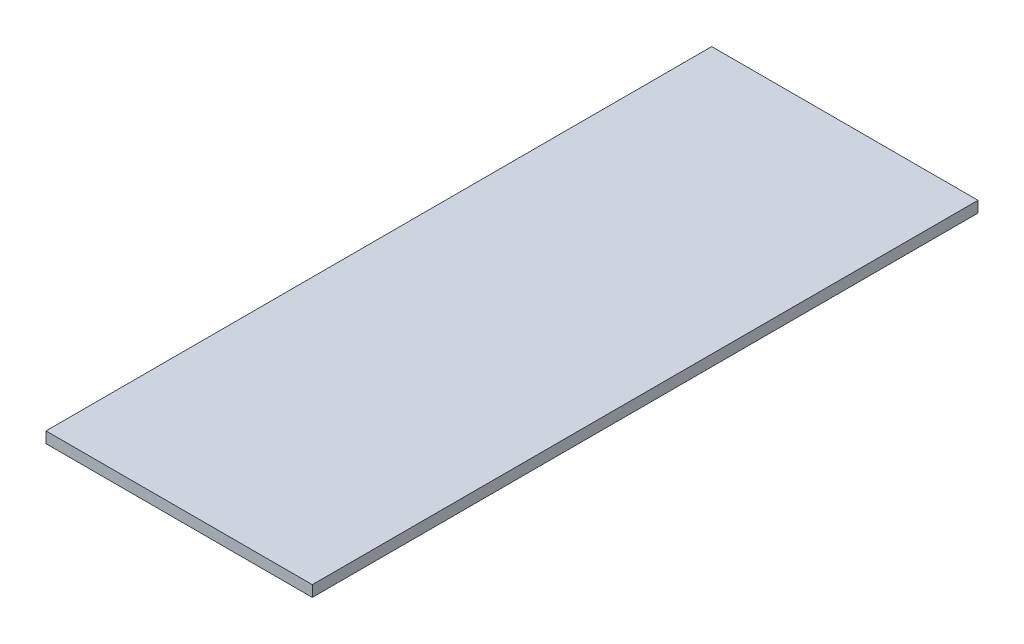
ISO-10303-21;
HEADER;
FILE_DESCRIPTION(('STEP AP214'),'2;1');
FILE_NAME('part.step','',(''),(''),'','','');
FILE_SCHEMA(('AUTOMOTIVE_DESIGN { 1 0 10303 214 1 1 1 1 }'));
ENDSEC;
DATA;
#1=APPLICATION_CONTEXT('core data for automotive mechanical design processes');
#2=APPLICATION_PROTOCOL_DEFINITION('international standard','automotive_design',2000,#1);
#3=PRODUCT_CONTEXT('',#1,'mechanical');
#4=PRODUCT('Part','Part','',(#3));
#5=PRODUCT_RELATED_PRODUCT_CATEGORY('part','',(#4));
#6=PRODUCT_DEFINITION_FORMATION('','',#4);
#7=PRODUCT_DEFINITION_CONTEXT('part definition',#1,'design');
#8=PRODUCT_DEFINITION('design','',#6,#7);
#9=PRODUCT_DEFINITION_SHAPE('','',#8);
#10=(LENGTH_UNIT() NAMED_UNIT(*) SI_UNIT(.MILLI.,.METRE.));
#11=(NAMED_UNIT(*) PLANE_ANGLE_UNIT() SI_UNIT($,.RADIAN.));
#12=(NAMED_UNIT(*) SI_UNIT($,.STERADIAN.) SOLID_ANGLE_UNIT());
#13=UNCERTAINTY_MEASURE_WITH_UNIT(LENGTH_MEASURE(1.E-05),#10,'distance_accuracy_value','');
#14=(GEOMETRIC_REPRESENTATION_CONTEXT(3) GLOBAL_UNCERTAINTY_ASSIGNED_CONTEXT((#13)) GLOBAL_UNIT_ASSIGNED_CONTEXT((#10,
#11,#12)) REPRESENTATION_CONTEXT('',''));
#15=CARTESIAN_POINT('',(0.,0.,0.));
#16=DIRECTION('',(0.,0.,1.));
#17=DIRECTION('',(1.,0.,0.));
#18=AXIS2_PLACEMENT_3D('',#15,#16,#17);
#19=CARTESIAN_POINT('',(-101.402602108138,6.35,-303.781267969407));
#20=DIRECTION('',(1.,0.,0.));
#21=DIRECTION('',(0.,0.,-1.));
#22=AXIS2_PLACEMENT_3D('',#19,#20,#21);
#23=PLANE('',#22);
#24=DIRECTION('',(0.,0.,1.));
#25=VECTOR('',#24,1.);
#26=CARTESIAN_POINT('',(-101.402602108138,0.,-303.781267969407));
#27=LINE('',#26,#25);
#28=CARTESIAN_POINT('',(-101.402602108138,0.,-303.781267969407));
#29=VERTEX_POINT('',#28);
#30=CARTESIAN_POINT('',(-101.402602108138,0.,77.2187320305928));
#31=VERTEX_POINT('',#30);
#32=EDGE_CURVE('E94',#29,#31,#27,.T.);
#33=ORIENTED_EDGE('',*,*,#32,.T.);
#34=DIRECTION('',(0.,-1.,0.));
#35=VECTOR('',#34,1.);
#36=CARTESIAN_POINT('',(-101.402602108138,6.35,77.2187320305928));
#37=LINE('',#36,#35);
#38=CARTESIAN_POINT('',(-101.402602108138,6.35,77.2187320305928));
#39=VERTEX_POINT('',#38);
#40=EDGE_CURVE('E11',#39,#31,#37,.T.);
#41=ORIENTED_EDGE('',*,*,#40,.F.);
#42=DIRECTION('',(0.,0.,1.));
#43=VECTOR('',#42,1.);
#44=CARTESIAN_POINT('',(-101.402602108138,6.35,-303.781267969407));
#45=LINE('',#44,#43);
#46=CARTESIAN_POINT('',(-101.402602108138,6.35,-303.781267969407));
#47=VERTEX_POINT('',#46);
#48=EDGE_CURVE('E82',#47,#39,#45,.T.);
#49=ORIENTED_EDGE('',*,*,#48,.F.);
#50=DIRECTION('',(0.,-1.,0.));
#51=VECTOR('',#50,1.);
#52=CARTESIAN_POINT('',(-101.402602108138,6.35,-303.781267969407));
#53=LINE('',#52,#51);
#54=EDGE_CURVE('E90',#47,#29,#53,.T.);
#55=ORIENTED_EDGE('',*,*,#54,.T.);
#56=EDGE_LOOP('',(#33,#41,#49,#55));
#57=FACE_BOUND('',#56,.T.);
#58=ADVANCED_FACE('F31',(#57),#23,.F.);
#59=CARTESIAN_POINT('',(-101.402602108138,6.35,77.2187320305928));
#60=DIRECTION('',(0.,0.,-1.));
#61=DIRECTION('',(-1.,0.,0.));
#62=AXIS2_PLACEMENT_3D('',#59,#60,#61);
#63=PLANE('',#62);
#64=DIRECTION('',(1.,0.,0.));
#65=VECTOR('',#64,1.);
#66=CARTESIAN_POINT('',(-101.402602108138,0.,77.2187320305928));
#67=LINE('',#66,#65);
#68=CARTESIAN_POINT('',(50.9973978918621,0.,77.2187320305928));
#69=VERTEX_POINT('',#68);
#70=EDGE_CURVE('E86',#31,#69,#67,.T.);
#71=ORIENTED_EDGE('',*,*,#70,.T.);
#72=DIRECTION('',(0.,-1.,0.));
#73=VECTOR('',#72,1.);
#74=CARTESIAN_POINT('',(50.9973978918621,6.35,77.2187320305928));
#75=LINE('',#74,#73);
#76=CARTESIAN_POINT('',(50.9973978918621,6.35,77.2187320305928));
#77=VERTEX_POINT('',#76);
#78=EDGE_CURVE('E39',#77,#69,#75,.T.);
#79=ORIENTED_EDGE('',*,*,#78,.F.);
#80=DIRECTION('',(1.,0.,0.));
#81=VECTOR('',#80,1.);
#82=CARTESIAN_POINT('',(-101.402602108138,6.35,77.2187320305928));
#83=LINE('',#82,#81);
#84=EDGE_CURVE('E77',#39,#77,#83,.T.);
#85=ORIENTED_EDGE('',*,*,#84,.F.);
#86=ORIENTED_EDGE('',*,*,#40,.T.);
#87=EDGE_LOOP('',(#71,#79,#85,#86));
#88=FACE_BOUND('',#87,.T.);
#89=ADVANCED_FACE('F85',(#88),#63,.F.);
#90=CARTESIAN_POINT('',(50.9973978918621,6.35,-303.781267969407));
#91=DIRECTION('',(-1.,0.,0.));
#92=DIRECTION('',(0.,0.,1.));
#93=AXIS2_PLACEMENT_3D('',#90,#91,#92);
#94=PLANE('',#93);
#95=DIRECTION('',(0.,0.,-1.));
#96=VECTOR('',#95,1.);
#97=CARTESIAN_POINT('',(50.9973978918621,0.,-303.781267969407));
#98=LINE('',#97,#96);
#99=CARTESIAN_POINT('',(50.9973978918621,0.,-303.781267969407));
#100=VERTEX_POINT('',#99);
#101=EDGE_CURVE('E64',#69,#100,#98,.T.);
#102=ORIENTED_EDGE('',*,*,#101,.T.);
#103=DIRECTION('',(0.,-1.,0.));
#104=VECTOR('',#103,1.);
#105=CARTESIAN_POINT('',(50.9973978918621,6.35,-303.781267969407));
#106=LINE('',#105,#104);
#107=CARTESIAN_POINT('',(50.9973978918621,6.35,-303.781267969407));
#108=VERTEX_POINT('',#107);
#109=EDGE_CURVE('E87',#108,#100,#106,.T.);
#110=ORIENTED_EDGE('',*,*,#109,.F.);
#111=DIRECTION('',(0.,0.,-1.));
#112=VECTOR('',#111,1.);
#113=CARTESIAN_POINT('',(50.9973978918621,6.35,-303.781267969407));
#114=LINE('',#113,#112);
#115=EDGE_CURVE('E80',#77,#108,#114,.T.);
#116=ORIENTED_EDGE('',*,*,#115,.F.);
#117=ORIENTED_EDGE('',*,*,#78,.T.);
#118=EDGE_LOOP('',(#102,#110,#116,#117));
#119=FACE_BOUND('',#118,.T.);
#120=ADVANCED_FACE('F88',(#119),#94,.F.);
#121=CARTESIAN_POINT('',(-101.402602108138,6.35,-303.781267969407));
#122=DIRECTION('',(0.,0.,1.));
#123=DIRECTION('',(1.,0.,0.));
#124=AXIS2_PLACEMENT_3D('',#121,#122,#123);
#125=PLANE('',#124);
#126=DIRECTION('',(-1.,0.,0.));
#127=VECTOR('',#126,1.);
#128=CARTESIAN_POINT('',(-101.402602108138,0.,-303.781267969407));
#129=LINE('',#128,#127);
#130=EDGE_CURVE('E70',#100,#29,#129,.T.);
#131=ORIENTED_EDGE('',*,*,#130,.T.);
#132=ORIENTED_EDGE('',*,*,#54,.F.);
#133=DIRECTION('',(-1.,0.,0.));
#134=VECTOR('',#133,1.);
#135=CARTESIAN_POINT('',(-101.402602108138,6.35,-303.781267969407));
#136=LINE('',#135,#134);
#137=EDGE_CURVE('E47',#108,#47,#136,.T.);
#138=ORIENTED_EDGE('',*,*,#137,.F.);
#139=ORIENTED_EDGE('',*,*,#109,.T.);
#140=EDGE_LOOP('',(#131,#132,#138,#139));
#141=FACE_BOUND('',#140,.T.);
#142=ADVANCED_FACE('F101',(#141),#125,.F.);
#143=CARTESIAN_POINT('',(-101.402602108138,6.35,77.2187320305928));
#144=DIRECTION('',(0.,1.,0.));
#145=DIRECTION('',(0.,0.,1.));
#146=AXIS2_PLACEMENT_3D('',#143,#144,#145);
#147=PLANE('',#146);
#148=ORIENTED_EDGE('',*,*,#48,.T.);
#149=ORIENTED_EDGE('',*,*,#84,.T.);
#150=ORIENTED_EDGE('',*,*,#115,.T.);
#151=ORIENTED_EDGE('',*,*,#137,.T.);
#152=EDGE_LOOP('',(#148,#149,#150,#151));
#153=FACE_BOUND('',#152,.T.);
#154=ADVANCED_FACE('F78',(#153),#147,.T.);
#155=CARTESIAN_POINT('',(-101.402602108138,0.,77.2187320305928));
#156=DIRECTION('',(0.,1.,0.));
#157=DIRECTION('',(0.,0.,1.));
#158=AXIS2_PLACEMENT_3D('',#155,#156,#157);
#159=PLANE('',#158);
#160=ORIENTED_EDGE('',*,*,#32,.F.);
#161=ORIENTED_EDGE('',*,*,#130,.F.);
#162=ORIENTED_EDGE('',*,*,#101,.F.);
#163=ORIENTED_EDGE('',*,*,#70,.F.);
#164=EDGE_LOOP('',(#160,#161,#162,#163));
#165=FACE_BOUND('',#164,.T.);
#166=ADVANCED_FACE('F104',(#165),#159,.F.);
#167=CLOSED_SHELL('',(#58,#89,#120,#142,#154,#166));
#168=MANIFOLD_SOLID_BREP('B2',#167);
#169=ADVANCED_BREP_SHAPE_REPRESENTATION('',(#18,#168),#14);
#170=SHAPE_DEFINITION_REPRESENTATION(#9,#169);
ENDSEC;
END-ISO-10303-21;
